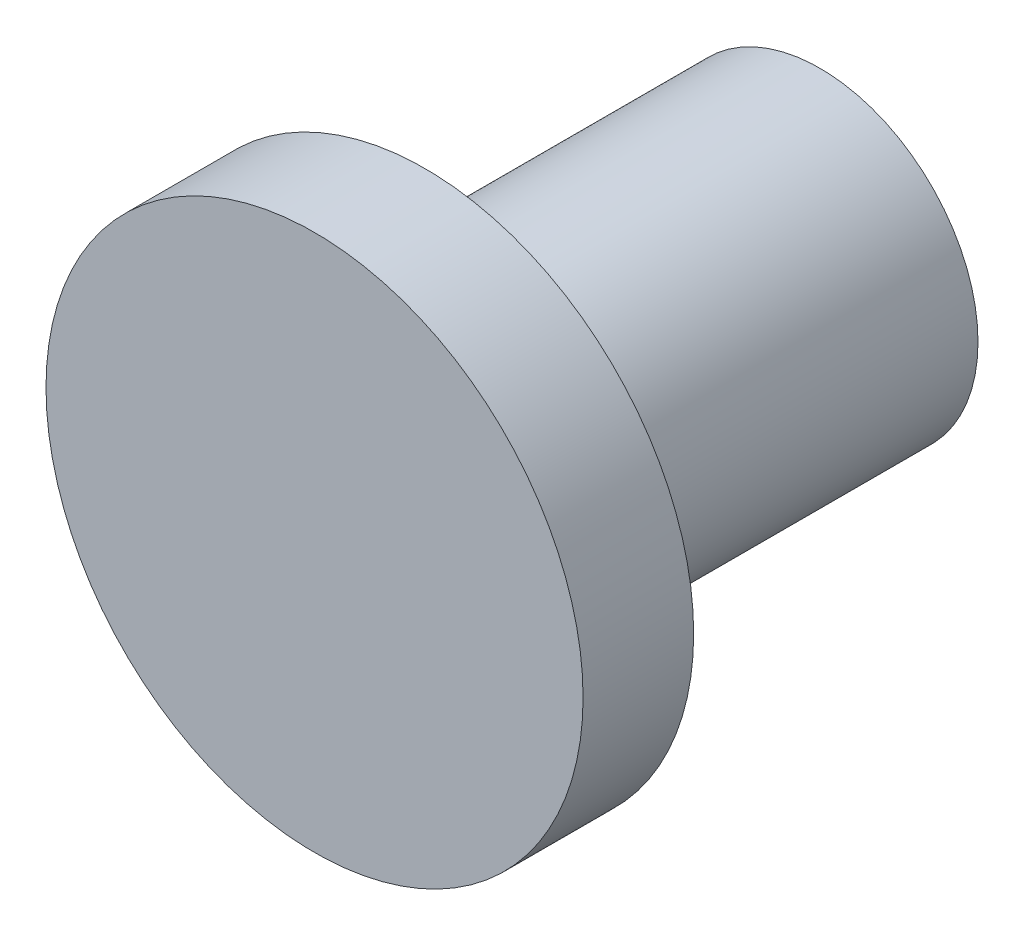
ISO-10303-21;
HEADER;
FILE_DESCRIPTION(('STEP AP214'),'2;1');
FILE_NAME('part.step','',(''),(''),'','','');
FILE_SCHEMA(('AUTOMOTIVE_DESIGN { 1 0 10303 214 1 1 1 1 }'));
ENDSEC;
DATA;
#1=APPLICATION_CONTEXT('core data for automotive mechanical design processes');
#2=APPLICATION_PROTOCOL_DEFINITION('international standard','automotive_design',2000,#1);
#3=PRODUCT_CONTEXT('',#1,'mechanical');
#4=PRODUCT('Part','Part','',(#3));
#5=PRODUCT_RELATED_PRODUCT_CATEGORY('part','',(#4));
#6=PRODUCT_DEFINITION_FORMATION('','',#4);
#7=PRODUCT_DEFINITION_CONTEXT('part definition',#1,'design');
#8=PRODUCT_DEFINITION('design','',#6,#7);
#9=PRODUCT_DEFINITION_SHAPE('','',#8);
#10=(LENGTH_UNIT() NAMED_UNIT(*) SI_UNIT(.MILLI.,.METRE.));
#11=(NAMED_UNIT(*) PLANE_ANGLE_UNIT() SI_UNIT($,.RADIAN.));
#12=(NAMED_UNIT(*) SI_UNIT($,.STERADIAN.) SOLID_ANGLE_UNIT());
#13=UNCERTAINTY_MEASURE_WITH_UNIT(LENGTH_MEASURE(1.E-05),#10,'distance_accuracy_value','');
#14=(GEOMETRIC_REPRESENTATION_CONTEXT(3) GLOBAL_UNCERTAINTY_ASSIGNED_CONTEXT((#13)) GLOBAL_UNIT_ASSIGNED_CONTEXT((#10,
#11,#12)) REPRESENTATION_CONTEXT('',''));
#15=CARTESIAN_POINT('',(0.,0.,0.));
#16=DIRECTION('',(0.,0.,1.));
#17=DIRECTION('',(1.,0.,0.));
#18=AXIS2_PLACEMENT_3D('',#15,#16,#17);
#19=CARTESIAN_POINT('',(0.,0.,0.));
#20=DIRECTION('',(0.,0.,-1.));
#21=DIRECTION('',(-1.,0.,0.));
#22=AXIS2_PLACEMENT_3D('',#19,#20,#21);
#23=CYLINDRICAL_SURFACE('',#22,1.);
#24=CARTESIAN_POINT('',(0.,0.,0.));
#25=DIRECTION('',(0.,0.,1.));
#26=DIRECTION('',(1.,0.,0.));
#27=AXIS2_PLACEMENT_3D('',#24,#25,#26);
#28=CIRCLE('',#27,1.);
#29=CARTESIAN_POINT('',(1.,0.,0.));
#30=VERTEX_POINT('',#29);
#31=EDGE_CURVE('E10',#30,#30,#28,.T.);
#32=ORIENTED_EDGE('',*,*,#31,.F.);
#33=EDGE_LOOP('',(#32));
#34=FACE_BOUND('',#33,.T.);
#35=CARTESIAN_POINT('',(0.,0.,-2.5));
#36=DIRECTION('',(0.,0.,1.));
#37=DIRECTION('',(1.,0.,0.));
#38=AXIS2_PLACEMENT_3D('',#35,#36,#37);
#39=CIRCLE('',#38,1.);
#40=CARTESIAN_POINT('',(1.,0.,-2.5));
#41=VERTEX_POINT('',#40);
#42=EDGE_CURVE('E37',#41,#41,#39,.T.);
#43=ORIENTED_EDGE('',*,*,#42,.T.);
#44=EDGE_LOOP('',(#43));
#45=FACE_BOUND('',#44,.T.);
#46=ADVANCED_FACE('F40',(#34,#45),#23,.T.);
#47=CARTESIAN_POINT('',(0.,0.,-2.5));
#48=DIRECTION('',(0.,0.,1.));
#49=DIRECTION('',(1.,0.,0.));
#50=AXIS2_PLACEMENT_3D('',#47,#48,#49);
#51=PLANE('',#50);
#52=ORIENTED_EDGE('',*,*,#42,.F.);
#53=EDGE_LOOP('',(#52));
#54=FACE_BOUND('',#53,.T.);
#55=ADVANCED_FACE('F58',(#54),#51,.F.);
#56=CARTESIAN_POINT('',(0.,0.,0.7));
#57=DIRECTION('',(0.,0.,-1.));
#58=DIRECTION('',(-1.,0.,0.));
#59=AXIS2_PLACEMENT_3D('',#56,#57,#58);
#60=CYLINDRICAL_SURFACE('',#59,1.7);
#61=CARTESIAN_POINT('',(0.,0.,0.7));
#62=DIRECTION('',(0.,0.,1.));
#63=DIRECTION('',(1.,0.,0.));
#64=AXIS2_PLACEMENT_3D('',#61,#62,#63);
#65=CIRCLE('',#64,1.7);
#66=CARTESIAN_POINT('',(1.7,0.,0.7));
#67=VERTEX_POINT('',#66);
#68=EDGE_CURVE('E50',#67,#67,#65,.T.);
#69=ORIENTED_EDGE('',*,*,#68,.F.);
#70=EDGE_LOOP('',(#69));
#71=FACE_BOUND('',#70,.T.);
#72=CARTESIAN_POINT('',(0.,0.,0.));
#73=DIRECTION('',(0.,0.,1.));
#74=DIRECTION('',(1.,0.,0.));
#75=AXIS2_PLACEMENT_3D('',#72,#73,#74);
#76=CIRCLE('',#75,1.7);
#77=CARTESIAN_POINT('',(1.7,0.,0.));
#78=VERTEX_POINT('',#77);
#79=EDGE_CURVE('E47',#78,#78,#76,.T.);
#80=ORIENTED_EDGE('',*,*,#79,.T.);
#81=EDGE_LOOP('',(#80));
#82=FACE_BOUND('',#81,.T.);
#83=ADVANCED_FACE('F60',(#71,#82),#60,.T.);
#84=CARTESIAN_POINT('',(0.,0.,0.7));
#85=DIRECTION('',(0.,0.,1.));
#86=DIRECTION('',(1.,0.,0.));
#87=AXIS2_PLACEMENT_3D('',#84,#85,#86);
#88=PLANE('',#87);
#89=ORIENTED_EDGE('',*,*,#68,.T.);
#90=EDGE_LOOP('',(#89));
#91=FACE_BOUND('',#90,.T.);
#92=ADVANCED_FACE('F54',(#91),#88,.T.);
#93=CARTESIAN_POINT('',(0.,0.,0.));
#94=DIRECTION('',(0.,0.,1.));
#95=DIRECTION('',(1.,0.,0.));
#96=AXIS2_PLACEMENT_3D('',#93,#94,#95);
#97=PLANE('',#96);
#98=ORIENTED_EDGE('',*,*,#31,.T.);
#99=EDGE_LOOP('',(#98));
#100=FACE_BOUND('',#99,.T.);
#101=ORIENTED_EDGE('',*,*,#79,.F.);
#102=EDGE_LOOP('',(#101));
#103=FACE_BOUND('',#102,.T.);
#104=ADVANCED_FACE('F63',(#100,#103),#97,.F.);
#105=CLOSED_SHELL('',(#46,#55,#83,#92,#104));
#106=MANIFOLD_SOLID_BREP('B2',#105);
#107=ADVANCED_BREP_SHAPE_REPRESENTATION('',(#18,#106),#14);
#108=SHAPE_DEFINITION_REPRESENTATION(#9,#107);
ENDSEC;
END-ISO-10303-21;
